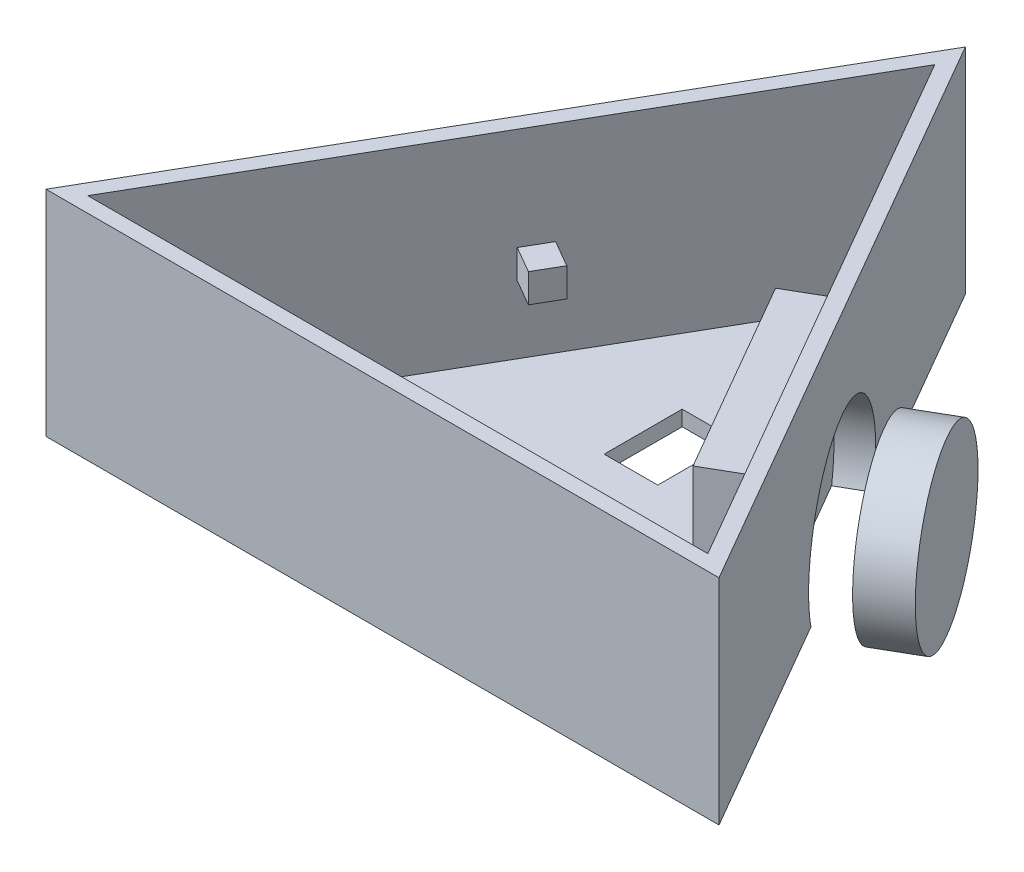
ISO-10303-21;
HEADER;
FILE_DESCRIPTION(('STEP AP214'),'2;1');
FILE_NAME('part.step','',(''),(''),'','','');
FILE_SCHEMA(('AUTOMOTIVE_DESIGN { 1 0 10303 214 1 1 1 1 }'));
ENDSEC;
DATA;
#1=APPLICATION_CONTEXT('core data for automotive mechanical design processes');
#2=APPLICATION_PROTOCOL_DEFINITION('international standard','automotive_design',2000,#1);
#3=PRODUCT_CONTEXT('',#1,'mechanical');
#4=PRODUCT('Part','Part','',(#3));
#5=PRODUCT_RELATED_PRODUCT_CATEGORY('part','',(#4));
#6=PRODUCT_DEFINITION_FORMATION('','',#4);
#7=PRODUCT_DEFINITION_CONTEXT('part definition',#1,'design');
#8=PRODUCT_DEFINITION('design','',#6,#7);
#9=PRODUCT_DEFINITION_SHAPE('','',#8);
#10=(LENGTH_UNIT() NAMED_UNIT(*) SI_UNIT(.MILLI.,.METRE.));
#11=(NAMED_UNIT(*) PLANE_ANGLE_UNIT() SI_UNIT($,.RADIAN.));
#12=(NAMED_UNIT(*) SI_UNIT($,.STERADIAN.) SOLID_ANGLE_UNIT());
#13=UNCERTAINTY_MEASURE_WITH_UNIT(LENGTH_MEASURE(1.E-05),#10,'distance_accuracy_value','');
#14=(GEOMETRIC_REPRESENTATION_CONTEXT(3) GLOBAL_UNCERTAINTY_ASSIGNED_CONTEXT((#13)) GLOBAL_UNIT_ASSIGNED_CONTEXT((#10,
#11,#12)) REPRESENTATION_CONTEXT('',''));
#15=CARTESIAN_POINT('',(0.,0.,0.));
#16=DIRECTION('',(0.,0.,1.));
#17=DIRECTION('',(1.,0.,0.));
#18=AXIS2_PLACEMENT_3D('',#15,#16,#17);
#19=CARTESIAN_POINT('',(76.6506350946109,11.,-107.762794416288));
#20=DIRECTION('',(-0.866025403784439,0.,0.5));
#21=DIRECTION('',(0.5,0.,0.866025403784439));
#22=AXIS2_PLACEMENT_3D('',#19,#20,#21);
#23=CYLINDRICAL_SURFACE('',#22,28.);
#24=CARTESIAN_POINT('',(76.6506350946109,11.,-107.762794416288));
#25=DIRECTION('',(0.866025403784439,0.,-0.5));
#26=DIRECTION('',(-0.5,0.,-0.866025403784439));
#27=AXIS2_PLACEMENT_3D('',#24,#25,#26);
#28=CIRCLE('',#27,28.);
#29=CARTESIAN_POINT('',(62.650635094611,11.,-132.011505722253));
#30=VERTEX_POINT('',#29);
#31=EDGE_CURVE('E11',#30,#30,#28,.T.);
#32=ORIENTED_EDGE('',*,*,#31,.F.);
#33=EDGE_LOOP('',(#32));
#34=FACE_BOUND('',#33,.T.);
#35=CARTESIAN_POINT('',(63.6602540378444,11.,-100.262794416288));
#36=DIRECTION('',(0.866025403784439,0.,-0.5));
#37=DIRECTION('',(-0.5,0.,-0.866025403784439));
#38=AXIS2_PLACEMENT_3D('',#35,#36,#37);
#39=CIRCLE('',#38,28.);
#40=CARTESIAN_POINT('',(49.6602540378444,11.,-124.511505722253));
#41=VERTEX_POINT('',#40);
#42=EDGE_CURVE('E49',#41,#41,#39,.T.);
#43=ORIENTED_EDGE('',*,*,#42,.T.);
#44=EDGE_LOOP('',(#43));
#45=FACE_BOUND('',#44,.T.);
#46=ADVANCED_FACE('F46',(#34,#45),#23,.T.);
#47=CARTESIAN_POINT('',(76.6506350946109,11.,-107.762794416288));
#48=DIRECTION('',(0.866025403784439,0.,-0.5));
#49=DIRECTION('',(-0.5,0.,-0.866025403784439));
#50=AXIS2_PLACEMENT_3D('',#47,#48,#49);
#51=PLANE('',#50);
#52=ORIENTED_EDGE('',*,*,#31,.T.);
#53=EDGE_LOOP('',(#52));
#54=FACE_BOUND('',#53,.T.);
#55=ADVANCED_FACE('F61',(#54),#51,.T.);
#56=CARTESIAN_POINT('',(63.6602540378444,11.,-100.262794416288));
#57=DIRECTION('',(0.866025403784439,0.,-0.5));
#58=DIRECTION('',(-0.5,0.,-0.866025403784439));
#59=AXIS2_PLACEMENT_3D('',#56,#57,#58);
#60=PLANE('',#59);
#61=ORIENTED_EDGE('',*,*,#42,.F.);
#62=EDGE_LOOP('',(#61));
#63=FACE_BOUND('',#62,.T.);
#64=ADVANCED_FACE('F59',(#63),#60,.F.);
#65=CLOSED_SHELL('',(#46,#55,#64));
#66=MANIFOLD_SOLID_BREP('B2',#65);
#67=CARTESIAN_POINT('',(101.339745962156,5.,-5.00000000000004));
#68=DIRECTION('',(0.866025403784439,0.,-0.5));
#69=DIRECTION('',(-0.5,0.,-0.866025403784439));
#70=AXIS2_PLACEMENT_3D('',#67,#68,#69);
#71=PLANE('',#70);
#72=DIRECTION('',(0.,-1.,0.));
#73=VECTOR('',#72,1.);
#74=CARTESIAN_POINT('',(34.3252978452721,161.290931408064,-121.072428979631));
#75=LINE('',#74,#73);
#76=CARTESIAN_POINT('',(34.3252978452721,50.,-121.072428979631));
#77=VERTEX_POINT('',#76);
#78=CARTESIAN_POINT('',(34.3252978452721,5.,-121.072428979631));
#79=VERTEX_POINT('',#78);
#80=EDGE_CURVE('E371',#77,#79,#75,.T.);
#81=ORIENTED_EDGE('',*,*,#80,.F.);
#82=DIRECTION('',(0.5,0.,0.866025403784439));
#83=VECTOR('',#82,1.);
#84=CARTESIAN_POINT('',(78.1698729810778,50.,-45.1313972081441));
#85=LINE('',#84,#83);
#86=CARTESIAN_POINT('',(71.1695395479671,50.,-57.256330384215));
#87=VERTEX_POINT('',#86);
#88=EDGE_CURVE('E365',#77,#87,#85,.T.);
#89=ORIENTED_EDGE('',*,*,#88,.T.);
#90=DIRECTION('',(0.,-1.,0.));
#91=VECTOR('',#90,1.);
#92=CARTESIAN_POINT('',(71.1695395479671,161.290931408064,-57.256330384215));
#93=LINE('',#92,#91);
#94=CARTESIAN_POINT('',(71.1695395479671,5.,-57.256330384215));
#95=VERTEX_POINT('',#94);
#96=EDGE_CURVE('E368',#87,#95,#93,.T.);
#97=ORIENTED_EDGE('',*,*,#96,.T.);
#98=DIRECTION('',(-0.5,0.,-0.866025403784439));
#99=VECTOR('',#98,1.);
#100=CARTESIAN_POINT('',(101.339745962156,5.,-5.00000000000004));
#101=LINE('',#100,#99);
#102=CARTESIAN_POINT('',(101.339745962156,5.,-5.00000000000004));
#103=VERTEX_POINT('',#102);
#104=EDGE_CURVE('E280',#103,#95,#101,.T.);
#105=ORIENTED_EDGE('',*,*,#104,.F.);
#106=DIRECTION('',(0.,1.,0.));
#107=VECTOR('',#106,1.);
#108=CARTESIAN_POINT('',(101.339745962156,5.,-5.00000000000004));
#109=LINE('',#108,#107);
#110=CARTESIAN_POINT('',(101.339745962156,70.,-5.00000000000004));
#111=VERTEX_POINT('',#110);
#112=EDGE_CURVE('E272',#103,#111,#109,.T.);
#113=ORIENTED_EDGE('',*,*,#112,.T.);
#114=DIRECTION('',(-0.5,0.,-0.866025403784439));
#115=VECTOR('',#114,1.);
#116=CARTESIAN_POINT('',(101.339745962156,70.,-5.00000000000004));
#117=LINE('',#116,#115);
#118=CARTESIAN_POINT('',(0.,70.,-180.525588832577));
#119=VERTEX_POINT('',#118);
#120=EDGE_CURVE('E282',#111,#119,#117,.T.);
#121=ORIENTED_EDGE('',*,*,#120,.T.);
#122=DIRECTION('',(0.,1.,0.));
#123=VECTOR('',#122,1.);
#124=CARTESIAN_POINT('',(0.,5.,-180.525588832577));
#125=LINE('',#124,#123);
#126=CARTESIAN_POINT('',(0.,5.,-180.525588832577));
#127=VERTEX_POINT('',#126);
#128=EDGE_CURVE('E271',#127,#119,#125,.T.);
#129=ORIENTED_EDGE('',*,*,#128,.F.);
#130=EDGE_CURVE('E294',#79,#127,#101,.T.);
#131=ORIENTED_EDGE('',*,*,#130,.F.);
#132=EDGE_LOOP('',(#81,#89,#97,#105,#113,#121,#129,#131));
#133=FACE_BOUND('',#132,.T.);
#134=ADVANCED_FACE('F88',(#133),#71,.F.);
#135=CARTESIAN_POINT('',(0.,5.,0.));
#136=DIRECTION('',(0.,1.,0.));
#137=DIRECTION('',(0.,0.,1.));
#138=AXIS2_PLACEMENT_3D('',#135,#136,#137);
#139=PLANE('',#138);
#140=DIRECTION('',(0.,0.,1.));
#141=VECTOR('',#140,1.);
#142=CARTESIAN_POINT('',(-8.75889582838885,5.,-81.2170523964966));
#143=LINE('',#142,#141);
#144=CARTESIAN_POINT('',(-8.75889582838885,5.,-106.715757463062));
#145=VERTEX_POINT('',#144);
#146=CARTESIAN_POINT('',(-8.75889582838885,5.,-81.2170523964966));
#147=VERTEX_POINT('',#146);
#148=EDGE_CURVE('E326',#145,#147,#143,.T.);
#149=ORIENTED_EDGE('',*,*,#148,.F.);
#150=DIRECTION('',(-1.,0.,0.));
#151=VECTOR('',#150,1.);
#152=CARTESIAN_POINT('',(8.75889582838885,5.,-106.715757463062));
#153=LINE('',#152,#151);
#154=CARTESIAN_POINT('',(8.75889582838885,5.,-106.715757463062));
#155=VERTEX_POINT('',#154);
#156=EDGE_CURVE('E313',#155,#145,#153,.T.);
#157=ORIENTED_EDGE('',*,*,#156,.F.);
#158=DIRECTION('',(0.,0.,-1.));
#159=VECTOR('',#158,1.);
#160=CARTESIAN_POINT('',(8.75889582838885,5.,-81.2170523964966));
#161=LINE('',#160,#159);
#162=CARTESIAN_POINT('',(8.75889582838885,5.,-81.2170523964966));
#163=VERTEX_POINT('',#162);
#164=EDGE_CURVE('E320',#163,#155,#161,.T.);
#165=ORIENTED_EDGE('',*,*,#164,.F.);
#166=DIRECTION('',(1.,0.,0.));
#167=VECTOR('',#166,1.);
#168=CARTESIAN_POINT('',(8.75889582838885,5.,-81.2170523964966));
#169=LINE('',#168,#167);
#170=EDGE_CURVE('E323',#147,#163,#169,.T.);
#171=ORIENTED_EDGE('',*,*,#170,.F.);
#172=EDGE_LOOP('',(#149,#157,#165,#171));
#173=FACE_BOUND('',#172,.T.);
#174=DIRECTION('',(0.5,0.,0.866025403784439));
#175=VECTOR('',#174,1.);
#176=CARTESIAN_POINT('',(61.1008914215475,5.,-35.2766161099565));
#177=LINE('',#176,#175);
#178=CARTESIAN_POINT('',(17.2563162857418,5.,-111.217647881443));
#179=VERTEX_POINT('',#178);
#180=CARTESIAN_POINT('',(54.1005579884368,5.,-47.4015492860273));
#181=VERTEX_POINT('',#180);
#182=EDGE_CURVE('E378',#179,#181,#177,.T.);
#183=ORIENTED_EDGE('',*,*,#182,.F.);
#184=DIRECTION('',(-0.866025403784439,0.,0.5));
#185=VECTOR('',#184,1.);
#186=CARTESIAN_POINT('',(-43.8445751358057,5.,-75.9410317714866));
#187=LINE('',#186,#185);
#188=EDGE_CURVE('E110',#79,#179,#187,.T.);
#189=ORIENTED_EDGE('',*,*,#188,.F.);
#190=ORIENTED_EDGE('',*,*,#130,.T.);
#191=DIRECTION('',(-0.5,0.,0.866025403784439));
#192=VECTOR('',#191,1.);
#193=CARTESIAN_POINT('',(0.,5.,-180.525588832577));
#194=LINE('',#193,#192);
#195=CARTESIAN_POINT('',(-101.339745962156,5.,-5.));
#196=VERTEX_POINT('',#195);
#197=EDGE_CURVE('E285',#127,#196,#194,.T.);
#198=ORIENTED_EDGE('',*,*,#197,.T.);
#199=DIRECTION('',(1.,0.,0.));
#200=VECTOR('',#199,1.);
#201=CARTESIAN_POINT('',(-101.339745962156,5.,-5.));
#202=LINE('',#201,#200);
#203=EDGE_CURVE('E295',#196,#103,#202,.T.);
#204=ORIENTED_EDGE('',*,*,#203,.T.);
#205=ORIENTED_EDGE('',*,*,#104,.T.);
#206=DIRECTION('',(0.866025403784439,0.,-0.5));
#207=VECTOR('',#206,1.);
#208=CARTESIAN_POINT('',(-7.00033343311071,5.,-12.1249331760708));
#209=LINE('',#208,#207);
#210=EDGE_CURVE('E376',#181,#95,#209,.T.);
#211=ORIENTED_EDGE('',*,*,#210,.F.);
#212=EDGE_LOOP('',(#183,#189,#190,#198,#204,#205,#211));
#213=FACE_BOUND('',#212,.T.);
#214=ADVANCED_FACE('F402',(#173,#213),#139,.T.);
#215=CARTESIAN_POINT('',(0.,5.,-180.525588832577));
#216=DIRECTION('',(-0.866025403784439,0.,-0.5));
#217=DIRECTION('',(-0.5,0.,0.866025403784439));
#218=AXIS2_PLACEMENT_3D('',#215,#216,#217);
#219=PLANE('',#218);
#220=DIRECTION('',(-0.5,0.,0.866025403784439));
#221=VECTOR('',#220,1.);
#222=CARTESIAN_POINT('',(0.,70.,-180.525588832577));
#223=LINE('',#222,#221);
#224=CARTESIAN_POINT('',(-101.339745962156,70.,-5.));
#225=VERTEX_POINT('',#224);
#226=EDGE_CURVE('E289',#119,#225,#223,.T.);
#227=ORIENTED_EDGE('',*,*,#226,.T.);
#228=DIRECTION('',(0.,1.,0.));
#229=VECTOR('',#228,1.);
#230=CARTESIAN_POINT('',(-101.339745962156,5.,-5.));
#231=LINE('',#230,#229);
#232=EDGE_CURVE('E277',#196,#225,#231,.T.);
#233=ORIENTED_EDGE('',*,*,#232,.F.);
#234=ORIENTED_EDGE('',*,*,#197,.F.);
#235=ORIENTED_EDGE('',*,*,#128,.T.);
#236=EDGE_LOOP('',(#227,#233,#234,#235));
#237=FACE_BOUND('',#236,.T.);
#238=DIRECTION('',(0.,-1.,0.));
#239=VECTOR('',#238,1.);
#240=CARTESIAN_POINT('',(-49.956900356164,27.1073849037862,-93.9976992270448));
#241=LINE('',#240,#239);
#242=CARTESIAN_POINT('',(-49.956900356164,36.5143194522375,-93.9976992270448));
#243=VERTEX_POINT('',#242);
#244=CARTESIAN_POINT('',(-49.956900356164,27.1073849037862,-93.9976992270448));
#245=VERTEX_POINT('',#244);
#246=EDGE_CURVE('E351',#243,#245,#241,.T.);
#247=ORIENTED_EDGE('',*,*,#246,.F.);
#248=DIRECTION('',(-0.5,0.,0.866025403784438));
#249=VECTOR('',#248,1.);
#250=CARTESIAN_POINT('',(-45.3680933465528,36.5143194522375,-101.94574611382));
#251=LINE('',#250,#249);
#252=CARTESIAN_POINT('',(-45.3680933465528,36.5143194522375,-101.94574611382));
#253=VERTEX_POINT('',#252);
#254=EDGE_CURVE('E341',#253,#243,#251,.T.);
#255=ORIENTED_EDGE('',*,*,#254,.F.);
#256=DIRECTION('',(0.,1.,0.));
#257=VECTOR('',#256,1.);
#258=CARTESIAN_POINT('',(-45.3680933465528,27.1073849037862,-101.94574611382));
#259=LINE('',#258,#257);
#260=CARTESIAN_POINT('',(-45.3680933465528,27.1073849037862,-101.94574611382));
#261=VERTEX_POINT('',#260);
#262=EDGE_CURVE('E345',#261,#253,#259,.T.);
#263=ORIENTED_EDGE('',*,*,#262,.F.);
#264=DIRECTION('',(0.5,0.,-0.866025403784438));
#265=VECTOR('',#264,1.);
#266=CARTESIAN_POINT('',(-45.3680933465528,27.1073849037862,-101.94574611382));
#267=LINE('',#266,#265);
#268=EDGE_CURVE('E348',#245,#261,#267,.T.);
#269=ORIENTED_EDGE('',*,*,#268,.F.);
#270=EDGE_LOOP('',(#247,#255,#263,#269));
#271=FACE_BOUND('',#270,.T.);
#272=ADVANCED_FACE('F419',(#237,#271),#219,.F.);
#273=CARTESIAN_POINT('',(-110.,70.,0.));
#274=DIRECTION('',(0.866025403784439,0.,0.5));
#275=DIRECTION('',(0.5,0.,-0.866025403784439));
#276=AXIS2_PLACEMENT_3D('',#273,#274,#275);
#277=PLANE('',#276);
#278=DIRECTION('',(-0.5,0.,0.866025403784439));
#279=VECTOR('',#278,1.);
#280=CARTESIAN_POINT('',(-110.,0.,0.));
#281=LINE('',#280,#279);
#282=CARTESIAN_POINT('',(0.,0.,-190.525588832577));
#283=VERTEX_POINT('',#282);
#284=CARTESIAN_POINT('',(-110.,0.,0.));
#285=VERTEX_POINT('',#284);
#286=EDGE_CURVE('E269',#283,#285,#281,.T.);
#287=ORIENTED_EDGE('',*,*,#286,.T.);
#288=DIRECTION('',(0.,-1.,0.));
#289=VECTOR('',#288,1.);
#290=CARTESIAN_POINT('',(-110.,70.,0.));
#291=LINE('',#290,#289);
#292=CARTESIAN_POINT('',(-110.,70.,0.));
#293=VERTEX_POINT('',#292);
#294=EDGE_CURVE('E259',#293,#285,#291,.T.);
#295=ORIENTED_EDGE('',*,*,#294,.F.);
#296=DIRECTION('',(-0.5,0.,0.866025403784439));
#297=VECTOR('',#296,1.);
#298=CARTESIAN_POINT('',(-110.,70.,0.));
#299=LINE('',#298,#297);
#300=CARTESIAN_POINT('',(0.,70.,-190.525588832577));
#301=VERTEX_POINT('',#300);
#302=EDGE_CURVE('E244',#301,#293,#299,.T.);
#303=ORIENTED_EDGE('',*,*,#302,.F.);
#304=DIRECTION('',(0.,-1.,0.));
#305=VECTOR('',#304,1.);
#306=CARTESIAN_POINT('',(0.,70.,-190.525588832577));
#307=LINE('',#306,#305);
#308=EDGE_CURVE('E254',#301,#283,#307,.T.);
#309=ORIENTED_EDGE('',*,*,#308,.T.);
#310=EDGE_LOOP('',(#287,#295,#303,#309));
#311=FACE_BOUND('',#310,.T.);
#312=ADVANCED_FACE('F90',(#311),#277,.F.);
#313=CARTESIAN_POINT('',(110.,70.,0.));
#314=DIRECTION('',(0.,0.,-1.));
#315=DIRECTION('',(-1.,0.,0.));
#316=AXIS2_PLACEMENT_3D('',#313,#314,#315);
#317=PLANE('',#316);
#318=DIRECTION('',(1.,0.,0.));
#319=VECTOR('',#318,1.);
#320=CARTESIAN_POINT('',(110.,0.,0.));
#321=LINE('',#320,#319);
#322=CARTESIAN_POINT('',(110.,0.,0.));
#323=VERTEX_POINT('',#322);
#324=EDGE_CURVE('E250',#285,#323,#321,.T.);
#325=ORIENTED_EDGE('',*,*,#324,.T.);
#326=DIRECTION('',(0.,-1.,0.));
#327=VECTOR('',#326,1.);
#328=CARTESIAN_POINT('',(110.,70.,0.));
#329=LINE('',#328,#327);
#330=CARTESIAN_POINT('',(110.,70.,0.));
#331=VERTEX_POINT('',#330);
#332=EDGE_CURVE('E243',#331,#323,#329,.T.);
#333=ORIENTED_EDGE('',*,*,#332,.F.);
#334=DIRECTION('',(1.,0.,0.));
#335=VECTOR('',#334,1.);
#336=CARTESIAN_POINT('',(110.,70.,0.));
#337=LINE('',#336,#335);
#338=EDGE_CURVE('E248',#293,#331,#337,.T.);
#339=ORIENTED_EDGE('',*,*,#338,.F.);
#340=ORIENTED_EDGE('',*,*,#294,.T.);
#341=EDGE_LOOP('',(#325,#333,#339,#340));
#342=FACE_BOUND('',#341,.T.);
#343=ADVANCED_FACE('F265',(#342),#317,.F.);
#344=CARTESIAN_POINT('',(0.,70.,-190.525588832577));
#345=DIRECTION('',(-0.866025403784439,0.,0.5));
#346=DIRECTION('',(0.5,0.,0.866025403784439));
#347=AXIS2_PLACEMENT_3D('',#344,#345,#346);
#348=PLANE('',#347);
#349=DIRECTION('',(-0.5,0.,-0.866025403784439));
#350=VECTOR('',#349,1.);
#351=CARTESIAN_POINT('',(0.,0.,-190.525588832577));
#352=LINE('',#351,#350);
#353=CARTESIAN_POINT('',(68.9552857369528,0.,-71.0915304857447));
#354=VERTEX_POINT('',#353);
#355=EDGE_CURVE('E237',#323,#354,#352,.T.);
#356=ORIENTED_EDGE('',*,*,#355,.T.);
#357=CARTESIAN_POINT('',(55.,11.,-95.2627944162883));
#358=DIRECTION('',(0.866025403784439,0.,-0.5));
#359=DIRECTION('',(-0.5,0.,-0.866025403784439));
#360=AXIS2_PLACEMENT_3D('',#357,#358,#359);
#361=CIRCLE('',#360,30.);
#362=CARTESIAN_POINT('',(41.0447142630471,0.,-119.434058346832));
#363=VERTEX_POINT('',#362);
#364=EDGE_CURVE('E224',#363,#354,#361,.T.);
#365=ORIENTED_EDGE('',*,*,#364,.F.);
#366=EDGE_CURVE('E245',#363,#283,#352,.T.);
#367=ORIENTED_EDGE('',*,*,#366,.T.);
#368=ORIENTED_EDGE('',*,*,#308,.F.);
#369=DIRECTION('',(-0.5,0.,-0.866025403784439));
#370=VECTOR('',#369,1.);
#371=CARTESIAN_POINT('',(0.,70.,-190.525588832577));
#372=LINE('',#371,#370);
#373=EDGE_CURVE('E257',#331,#301,#372,.T.);
#374=ORIENTED_EDGE('',*,*,#373,.F.);
#375=ORIENTED_EDGE('',*,*,#332,.T.);
#376=EDGE_LOOP('',(#356,#365,#367,#368,#374,#375));
#377=FACE_BOUND('',#376,.T.);
#378=ADVANCED_FACE('F240',(#377),#348,.F.);
#379=CARTESIAN_POINT('',(0.,70.,0.));
#380=DIRECTION('',(0.,-1.,0.));
#381=DIRECTION('',(0.,0.,-1.));
#382=AXIS2_PLACEMENT_3D('',#379,#380,#381);
#383=PLANE('',#382);
#384=DIRECTION('',(1.,0.,0.));
#385=VECTOR('',#384,1.);
#386=CARTESIAN_POINT('',(-101.339745962156,70.,-5.));
#387=LINE('',#386,#385);
#388=EDGE_CURVE('E286',#225,#111,#387,.T.);
#389=ORIENTED_EDGE('',*,*,#388,.F.);
#390=ORIENTED_EDGE('',*,*,#226,.F.);
#391=ORIENTED_EDGE('',*,*,#120,.F.);
#392=EDGE_LOOP('',(#389,#390,#391));
#393=FACE_BOUND('',#392,.T.);
#394=ORIENTED_EDGE('',*,*,#302,.T.);
#395=ORIENTED_EDGE('',*,*,#338,.T.);
#396=ORIENTED_EDGE('',*,*,#373,.T.);
#397=EDGE_LOOP('',(#394,#395,#396));
#398=FACE_BOUND('',#397,.T.);
#399=ADVANCED_FACE('F432',(#393,#398),#383,.F.);
#400=CARTESIAN_POINT('',(0.,0.,0.));
#401=DIRECTION('',(0.,-1.,0.));
#402=DIRECTION('',(0.,0.,-1.));
#403=AXIS2_PLACEMENT_3D('',#400,#401,#402);
#404=PLANE('',#403);
#405=DIRECTION('',(0.866025403784439,0.,-0.5));
#406=VECTOR('',#405,1.);
#407=CARTESIAN_POINT('',(32.3844602252027,0.,-114.434058346832));
#408=LINE('',#407,#406);
#409=CARTESIAN_POINT('',(32.3844602252027,0.,-114.434058346832));
#410=VERTEX_POINT('',#409);
#411=EDGE_CURVE('E44',#410,#363,#408,.T.);
#412=ORIENTED_EDGE('',*,*,#411,.F.);
#413=DIRECTION('',(0.5,0.,0.866025403784439));
#414=VECTOR('',#413,1.);
#415=CARTESIAN_POINT('',(73.8397459621556,0.,-42.6313972081441));
#416=LINE('',#415,#414);
#417=CARTESIAN_POINT('',(60.2950316991084,0.,-66.0915304857447));
#418=VERTEX_POINT('',#417);
#419=EDGE_CURVE('E238',#410,#418,#416,.T.);
#420=ORIENTED_EDGE('',*,*,#419,.T.);
#421=DIRECTION('',(0.866025403784439,0.,-0.5));
#422=VECTOR('',#421,1.);
#423=CARTESIAN_POINT('',(60.2950316991084,0.,-66.0915304857447));
#424=LINE('',#423,#422);
#425=EDGE_CURVE('E96',#354,#418,#424,.F.);
#426=ORIENTED_EDGE('',*,*,#425,.F.);
#427=ORIENTED_EDGE('',*,*,#355,.F.);
#428=ORIENTED_EDGE('',*,*,#324,.F.);
#429=ORIENTED_EDGE('',*,*,#286,.F.);
#430=ORIENTED_EDGE('',*,*,#366,.F.);
#431=EDGE_LOOP('',(#412,#420,#426,#427,#428,#429,#430));
#432=FACE_BOUND('',#431,.T.);
#433=DIRECTION('',(0.,0.,-1.));
#434=VECTOR('',#433,1.);
#435=CARTESIAN_POINT('',(-8.75889582838885,0.,0.));
#436=LINE('',#435,#434);
#437=CARTESIAN_POINT('',(-8.75889582838885,0.,-81.2170523964966));
#438=VERTEX_POINT('',#437);
#439=CARTESIAN_POINT('',(-8.75889582838885,0.,-106.715757463062));
#440=VERTEX_POINT('',#439);
#441=EDGE_CURVE('E291',#438,#440,#436,.T.);
#442=ORIENTED_EDGE('',*,*,#441,.F.);
#443=DIRECTION('',(-1.,0.,0.));
#444=VECTOR('',#443,1.);
#445=CARTESIAN_POINT('',(0.,0.,-81.2170523964966));
#446=LINE('',#445,#444);
#447=CARTESIAN_POINT('',(8.75889582838885,0.,-81.2170523964966));
#448=VERTEX_POINT('',#447);
#449=EDGE_CURVE('E306',#448,#438,#446,.T.);
#450=ORIENTED_EDGE('',*,*,#449,.F.);
#451=DIRECTION('',(0.,0.,1.));
#452=VECTOR('',#451,1.);
#453=CARTESIAN_POINT('',(8.75889582838885,0.,0.));
#454=LINE('',#453,#452);
#455=CARTESIAN_POINT('',(8.75889582838885,0.,-106.715757463062));
#456=VERTEX_POINT('',#455);
#457=EDGE_CURVE('E303',#456,#448,#454,.T.);
#458=ORIENTED_EDGE('',*,*,#457,.F.);
#459=DIRECTION('',(1.,0.,0.));
#460=VECTOR('',#459,1.);
#461=CARTESIAN_POINT('',(0.,0.,-106.715757463062));
#462=LINE('',#461,#460);
#463=EDGE_CURVE('E301',#440,#456,#462,.T.);
#464=ORIENTED_EDGE('',*,*,#463,.F.);
#465=EDGE_LOOP('',(#442,#450,#458,#464));
#466=FACE_BOUND('',#465,.T.);
#467=ADVANCED_FACE('F235',(#432,#466),#404,.T.);
#468=CARTESIAN_POINT('',(-101.339745962156,5.,-5.));
#469=DIRECTION('',(0.,0.,1.));
#470=DIRECTION('',(1.,0.,0.));
#471=AXIS2_PLACEMENT_3D('',#468,#469,#470);
#472=PLANE('',#471);
#473=ORIENTED_EDGE('',*,*,#388,.T.);
#474=ORIENTED_EDGE('',*,*,#112,.F.);
#475=ORIENTED_EDGE('',*,*,#203,.F.);
#476=ORIENTED_EDGE('',*,*,#232,.T.);
#477=EDGE_LOOP('',(#473,#474,#475,#476));
#478=FACE_BOUND('',#477,.T.);
#479=ADVANCED_FACE('F424',(#478),#472,.F.);
#480=CARTESIAN_POINT('',(-8.75889582838885,-60.,-81.2170523964966));
#481=DIRECTION('',(-1.,0.,0.));
#482=DIRECTION('',(0.,0.,1.));
#483=AXIS2_PLACEMENT_3D('',#480,#481,#482);
#484=PLANE('',#483);
#485=ORIENTED_EDGE('',*,*,#441,.T.);
#486=DIRECTION('',(0.,1.,0.));
#487=VECTOR('',#486,1.);
#488=CARTESIAN_POINT('',(-8.75889582838885,-60.,-106.715757463062));
#489=LINE('',#488,#487);
#490=EDGE_CURVE('E308',#440,#145,#489,.T.);
#491=ORIENTED_EDGE('',*,*,#490,.T.);
#492=ORIENTED_EDGE('',*,*,#148,.T.);
#493=DIRECTION('',(0.,1.,0.));
#494=VECTOR('',#493,1.);
#495=CARTESIAN_POINT('',(-8.75889582838885,-60.,-81.2170523964966));
#496=LINE('',#495,#494);
#497=EDGE_CURVE('E309',#438,#147,#496,.T.);
#498=ORIENTED_EDGE('',*,*,#497,.F.);
#499=EDGE_LOOP('',(#485,#491,#492,#498));
#500=FACE_BOUND('',#499,.T.);
#501=ADVANCED_FACE('F427',(#500),#484,.F.);
#502=CARTESIAN_POINT('',(8.75889582838885,-60.,-106.715757463062));
#503=DIRECTION('',(0.,0.,-1.));
#504=DIRECTION('',(-1.,0.,0.));
#505=AXIS2_PLACEMENT_3D('',#502,#503,#504);
#506=PLANE('',#505);
#507=ORIENTED_EDGE('',*,*,#463,.T.);
#508=DIRECTION('',(0.,1.,0.));
#509=VECTOR('',#508,1.);
#510=CARTESIAN_POINT('',(8.75889582838885,-60.,-106.715757463062));
#511=LINE('',#510,#509);
#512=EDGE_CURVE('E315',#456,#155,#511,.T.);
#513=ORIENTED_EDGE('',*,*,#512,.T.);
#514=ORIENTED_EDGE('',*,*,#156,.T.);
#515=ORIENTED_EDGE('',*,*,#490,.F.);
#516=EDGE_LOOP('',(#507,#513,#514,#515));
#517=FACE_BOUND('',#516,.T.);
#518=ADVANCED_FACE('F529',(#517),#506,.F.);
#519=CARTESIAN_POINT('',(8.75889582838885,-60.,-81.2170523964966));
#520=DIRECTION('',(1.,0.,0.));
#521=DIRECTION('',(0.,0.,-1.));
#522=AXIS2_PLACEMENT_3D('',#519,#520,#521);
#523=PLANE('',#522);
#524=ORIENTED_EDGE('',*,*,#457,.T.);
#525=DIRECTION('',(0.,1.,0.));
#526=VECTOR('',#525,1.);
#527=CARTESIAN_POINT('',(8.75889582838885,-60.,-81.2170523964966));
#528=LINE('',#527,#526);
#529=EDGE_CURVE('E312',#448,#163,#528,.T.);
#530=ORIENTED_EDGE('',*,*,#529,.T.);
#531=ORIENTED_EDGE('',*,*,#164,.T.);
#532=ORIENTED_EDGE('',*,*,#512,.F.);
#533=EDGE_LOOP('',(#524,#530,#531,#532));
#534=FACE_BOUND('',#533,.T.);
#535=ADVANCED_FACE('F536',(#534),#523,.F.);
#536=CARTESIAN_POINT('',(8.75889582838885,-60.,-81.2170523964966));
#537=DIRECTION('',(0.,0.,1.));
#538=DIRECTION('',(1.,0.,0.));
#539=AXIS2_PLACEMENT_3D('',#536,#537,#538);
#540=PLANE('',#539);
#541=ORIENTED_EDGE('',*,*,#449,.T.);
#542=ORIENTED_EDGE('',*,*,#497,.T.);
#543=ORIENTED_EDGE('',*,*,#170,.T.);
#544=ORIENTED_EDGE('',*,*,#529,.F.);
#545=EDGE_LOOP('',(#541,#542,#543,#544));
#546=FACE_BOUND('',#545,.T.);
#547=ADVANCED_FACE('F544',(#546),#540,.F.);
#548=CARTESIAN_POINT('',(-41.2966463183196,27.1073849037862,-88.9976992270448));
#549=DIRECTION('',(0.5,0.,-0.866025403784439));
#550=DIRECTION('',(-0.866025403784439,0.,-0.5));
#551=AXIS2_PLACEMENT_3D('',#548,#549,#550);
#552=PLANE('',#551);
#553=ORIENTED_EDGE('',*,*,#246,.T.);
#554=DIRECTION('',(-0.866025403784439,0.,-0.5));
#555=VECTOR('',#554,1.);
#556=CARTESIAN_POINT('',(-41.2966463183196,27.1073849037862,-88.9976992270448));
#557=LINE('',#556,#555);
#558=CARTESIAN_POINT('',(-41.2966463183196,27.1073849037862,-88.9976992270448));
#559=VERTEX_POINT('',#558);
#560=EDGE_CURVE('E328',#559,#245,#557,.T.);
#561=ORIENTED_EDGE('',*,*,#560,.F.);
#562=DIRECTION('',(0.,-1.,0.));
#563=VECTOR('',#562,1.);
#564=CARTESIAN_POINT('',(-41.2966463183196,27.1073849037862,-88.9976992270448));
#565=LINE('',#564,#563);
#566=CARTESIAN_POINT('',(-41.2966463183196,36.5143194522375,-88.9976992270448));
#567=VERTEX_POINT('',#566);
#568=EDGE_CURVE('E344',#567,#559,#565,.T.);
#569=ORIENTED_EDGE('',*,*,#568,.F.);
#570=DIRECTION('',(-0.866025403784439,0.,-0.5));
#571=VECTOR('',#570,1.);
#572=CARTESIAN_POINT('',(-41.2966463183196,36.5143194522375,-88.9976992270448));
#573=LINE('',#572,#571);
#574=EDGE_CURVE('E337',#567,#243,#573,.T.);
#575=ORIENTED_EDGE('',*,*,#574,.T.);
#576=EDGE_LOOP('',(#553,#561,#569,#575));
#577=FACE_BOUND('',#576,.T.);
#578=ADVANCED_FACE('F551',(#577),#552,.F.);
#579=CARTESIAN_POINT('',(-36.7078393087084,27.1073849037862,-96.9457461138196));
#580=DIRECTION('',(0.,1.,0.));
#581=DIRECTION('',(0.,0.,1.));
#582=AXIS2_PLACEMENT_3D('',#579,#580,#581);
#583=PLANE('',#582);
#584=ORIENTED_EDGE('',*,*,#268,.T.);
#585=DIRECTION('',(-0.866025403784439,0.,-0.5));
#586=VECTOR('',#585,1.);
#587=CARTESIAN_POINT('',(-36.7078393087084,27.1073849037862,-96.9457461138196));
#588=LINE('',#587,#586);
#589=CARTESIAN_POINT('',(-36.7078393087084,27.1073849037862,-96.9457461138196));
#590=VERTEX_POINT('',#589);
#591=EDGE_CURVE('E331',#590,#261,#588,.T.);
#592=ORIENTED_EDGE('',*,*,#591,.F.);
#593=DIRECTION('',(0.5,0.,-0.866025403784438));
#594=VECTOR('',#593,1.);
#595=CARTESIAN_POINT('',(-36.7078393087084,27.1073849037862,-96.9457461138196));
#596=LINE('',#595,#594);
#597=EDGE_CURVE('E358',#559,#590,#596,.T.);
#598=ORIENTED_EDGE('',*,*,#597,.F.);
#599=ORIENTED_EDGE('',*,*,#560,.T.);
#600=EDGE_LOOP('',(#584,#592,#598,#599));
#601=FACE_BOUND('',#600,.T.);
#602=ADVANCED_FACE('F558',(#601),#583,.F.);
#603=CARTESIAN_POINT('',(-36.7078393087084,27.1073849037862,-96.9457461138196));
#604=DIRECTION('',(-0.5,0.,0.866025403784439));
#605=DIRECTION('',(0.866025403784439,0.,0.5));
#606=AXIS2_PLACEMENT_3D('',#603,#604,#605);
#607=PLANE('',#606);
#608=ORIENTED_EDGE('',*,*,#262,.T.);
#609=DIRECTION('',(-0.866025403784439,0.,-0.5));
#610=VECTOR('',#609,1.);
#611=CARTESIAN_POINT('',(-36.7078393087084,36.5143194522375,-96.9457461138196));
#612=LINE('',#611,#610);
#613=CARTESIAN_POINT('',(-36.7078393087084,36.5143194522375,-96.9457461138196));
#614=VERTEX_POINT('',#613);
#615=EDGE_CURVE('E334',#614,#253,#612,.T.);
#616=ORIENTED_EDGE('',*,*,#615,.F.);
#617=DIRECTION('',(0.,1.,0.));
#618=VECTOR('',#617,1.);
#619=CARTESIAN_POINT('',(-36.7078393087084,27.1073849037862,-96.9457461138196));
#620=LINE('',#619,#618);
#621=EDGE_CURVE('E356',#590,#614,#620,.T.);
#622=ORIENTED_EDGE('',*,*,#621,.F.);
#623=ORIENTED_EDGE('',*,*,#591,.T.);
#624=EDGE_LOOP('',(#608,#616,#622,#623));
#625=FACE_BOUND('',#624,.T.);
#626=ADVANCED_FACE('F566',(#625),#607,.F.);
#627=CARTESIAN_POINT('',(-36.7078393087084,36.5143194522375,-96.9457461138196));
#628=DIRECTION('',(0.,-1.,0.));
#629=DIRECTION('',(0.,0.,-1.));
#630=AXIS2_PLACEMENT_3D('',#627,#628,#629);
#631=PLANE('',#630);
#632=ORIENTED_EDGE('',*,*,#254,.T.);
#633=ORIENTED_EDGE('',*,*,#574,.F.);
#634=DIRECTION('',(-0.5,0.,0.866025403784438));
#635=VECTOR('',#634,1.);
#636=CARTESIAN_POINT('',(-36.7078393087084,36.5143194522375,-96.9457461138196));
#637=LINE('',#636,#635);
#638=EDGE_CURVE('E340',#614,#567,#637,.T.);
#639=ORIENTED_EDGE('',*,*,#638,.F.);
#640=ORIENTED_EDGE('',*,*,#615,.T.);
#641=EDGE_LOOP('',(#632,#633,#639,#640));
#642=FACE_BOUND('',#641,.T.);
#643=ADVANCED_FACE('F574',(#642),#631,.F.);
#644=CARTESIAN_POINT('',(-69.5096189432334,0.,-40.1313972081442));
#645=DIRECTION('',(0.866025403784439,0.,0.5));
#646=DIRECTION('',(0.5,0.,-0.866025403784439));
#647=AXIS2_PLACEMENT_3D('',#644,#645,#646);
#648=PLANE('',#647);
#649=ORIENTED_EDGE('',*,*,#568,.T.);
#650=ORIENTED_EDGE('',*,*,#597,.T.);
#651=ORIENTED_EDGE('',*,*,#621,.T.);
#652=ORIENTED_EDGE('',*,*,#638,.T.);
#653=EDGE_LOOP('',(#649,#650,#651,#652));
#654=FACE_BOUND('',#653,.T.);
#655=ADVANCED_FACE('F412',(#654),#648,.T.);
#656=CARTESIAN_POINT('',(-43.8445751358057,161.290931408064,-75.9410317714866));
#657=DIRECTION('',(0.5,0.,0.866025403784439));
#658=DIRECTION('',(0.866025403784439,0.,-0.5));
#659=AXIS2_PLACEMENT_3D('',#656,#657,#658);
#660=PLANE('',#659);
#661=DIRECTION('',(0.,-1.,0.));
#662=VECTOR('',#661,1.);
#663=CARTESIAN_POINT('',(17.2563162857418,161.290931408064,-111.217647881443));
#664=LINE('',#663,#662);
#665=CARTESIAN_POINT('',(17.2563162857418,50.,-111.217647881443));
#666=VERTEX_POINT('',#665);
#667=EDGE_CURVE('E373',#666,#179,#664,.T.);
#668=ORIENTED_EDGE('',*,*,#667,.F.);
#669=DIRECTION('',(0.866025403784439,0.,-0.5));
#670=VECTOR('',#669,1.);
#671=CARTESIAN_POINT('',(-43.8445751358057,50.,-75.9410317714866));
#672=LINE('',#671,#670);
#673=EDGE_CURVE('E362',#666,#77,#672,.T.);
#674=ORIENTED_EDGE('',*,*,#673,.T.);
#675=ORIENTED_EDGE('',*,*,#80,.T.);
#676=ORIENTED_EDGE('',*,*,#188,.T.);
#677=EDGE_LOOP('',(#668,#674,#675,#676));
#678=FACE_BOUND('',#677,.T.);
#679=ADVANCED_FACE('F395',(#678),#660,.F.);
#680=CARTESIAN_POINT('',(-7.00033343311071,161.290931408064,-12.1249331760708));
#681=DIRECTION('',(-0.5,0.,-0.866025403784439));
#682=DIRECTION('',(-0.866025403784439,0.,0.5));
#683=AXIS2_PLACEMENT_3D('',#680,#681,#682);
#684=PLANE('',#683);
#685=ORIENTED_EDGE('',*,*,#96,.F.);
#686=DIRECTION('',(-0.866025403784439,0.,0.5));
#687=VECTOR('',#686,1.);
#688=CARTESIAN_POINT('',(-7.00033343311071,50.,-12.1249331760708));
#689=LINE('',#688,#687);
#690=CARTESIAN_POINT('',(54.1005579884368,50.,-47.4015492860274));
#691=VERTEX_POINT('',#690);
#692=EDGE_CURVE('E383',#87,#691,#689,.T.);
#693=ORIENTED_EDGE('',*,*,#692,.T.);
#694=DIRECTION('',(0.,-1.,0.));
#695=VECTOR('',#694,1.);
#696=CARTESIAN_POINT('',(54.1005579884368,161.290931408064,-47.4015492860273));
#697=LINE('',#696,#695);
#698=EDGE_CURVE('E366',#691,#181,#697,.T.);
#699=ORIENTED_EDGE('',*,*,#698,.T.);
#700=ORIENTED_EDGE('',*,*,#210,.T.);
#701=EDGE_LOOP('',(#685,#693,#699,#700));
#702=FACE_BOUND('',#701,.T.);
#703=ADVANCED_FACE('F404',(#702),#684,.F.);
#704=CARTESIAN_POINT('',(61.1008914215475,161.290931408064,-35.2766161099565));
#705=DIRECTION('',(0.866025403784439,0.,-0.5));
#706=DIRECTION('',(-0.5,0.,-0.866025403784439));
#707=AXIS2_PLACEMENT_3D('',#704,#705,#706);
#708=PLANE('',#707);
#709=ORIENTED_EDGE('',*,*,#698,.F.);
#710=DIRECTION('',(-0.5,0.,-0.866025403784439));
#711=VECTOR('',#710,1.);
#712=CARTESIAN_POINT('',(61.1008914215475,50.,-35.2766161099565));
#713=LINE('',#712,#711);
#714=EDGE_CURVE('E354',#691,#666,#713,.T.);
#715=ORIENTED_EDGE('',*,*,#714,.T.);
#716=ORIENTED_EDGE('',*,*,#667,.T.);
#717=ORIENTED_EDGE('',*,*,#182,.T.);
#718=EDGE_LOOP('',(#709,#715,#716,#717));
#719=FACE_BOUND('',#718,.T.);
#720=ADVANCED_FACE('F399',(#719),#708,.F.);
#721=CARTESIAN_POINT('',(0.,50.,0.));
#722=DIRECTION('',(0.,-1.,0.));
#723=DIRECTION('',(0.,0.,-1.));
#724=AXIS2_PLACEMENT_3D('',#721,#722,#723);
#725=PLANE('',#724);
#726=ORIENTED_EDGE('',*,*,#692,.F.);
#727=ORIENTED_EDGE('',*,*,#88,.F.);
#728=ORIENTED_EDGE('',*,*,#673,.F.);
#729=ORIENTED_EDGE('',*,*,#714,.F.);
#730=EDGE_LOOP('',(#726,#727,#728,#729));
#731=FACE_BOUND('',#730,.T.);
#732=ADVANCED_FACE('F394',(#731),#725,.F.);
#733=CARTESIAN_POINT('',(46.3397459621556,11.,-90.2627944162883));
#734=DIRECTION('',(0.866025403784439,0.,-0.5));
#735=DIRECTION('',(-0.5,0.,-0.866025403784439));
#736=AXIS2_PLACEMENT_3D('',#733,#734,#735);
#737=CYLINDRICAL_SURFACE('',#736,30.);
#738=ORIENTED_EDGE('',*,*,#411,.T.);
#739=ORIENTED_EDGE('',*,*,#364,.T.);
#740=ORIENTED_EDGE('',*,*,#425,.T.);
#741=CARTESIAN_POINT('',(46.3397459621556,11.,-90.2627944162883));
#742=DIRECTION('',(0.866025403784439,0.,-0.5));
#743=DIRECTION('',(-0.5,0.,-0.866025403784439));
#744=AXIS2_PLACEMENT_3D('',#741,#742,#743);
#745=CIRCLE('',#744,30.);
#746=EDGE_CURVE('E102',#410,#418,#745,.T.);
#747=ORIENTED_EDGE('',*,*,#746,.F.);
#748=EDGE_LOOP('',(#738,#739,#740,#747));
#749=FACE_BOUND('',#748,.T.);
#750=ADVANCED_FACE('F226',(#749),#737,.F.);
#751=CARTESIAN_POINT('',(46.3397459621556,11.,-90.2627944162883));
#752=DIRECTION('',(0.866025403784439,0.,-0.5));
#753=DIRECTION('',(-0.5,0.,-0.866025403784439));
#754=AXIS2_PLACEMENT_3D('',#751,#752,#753);
#755=PLANE('',#754);
#756=ORIENTED_EDGE('',*,*,#746,.T.);
#757=ORIENTED_EDGE('',*,*,#419,.F.);
#758=EDGE_LOOP('',(#756,#757));
#759=FACE_BOUND('',#758,.T.);
#760=ADVANCED_FACE('F508',(#759),#755,.T.);
#761=CLOSED_SHELL('',(#134,#214,#272,#312,#343,#378,#399,#467,#479,#501,#518,#535,#547,#578,
#602,#626,#643,#655,#679,#703,#720,#732,#750,#760));
#762=MANIFOLD_SOLID_BREP('B6',#761);
#763=ADVANCED_BREP_SHAPE_REPRESENTATION('',(#18,#66,#762),#14);
#764=SHAPE_DEFINITION_REPRESENTATION(#9,#763);
ENDSEC;
END-ISO-10303-21;
